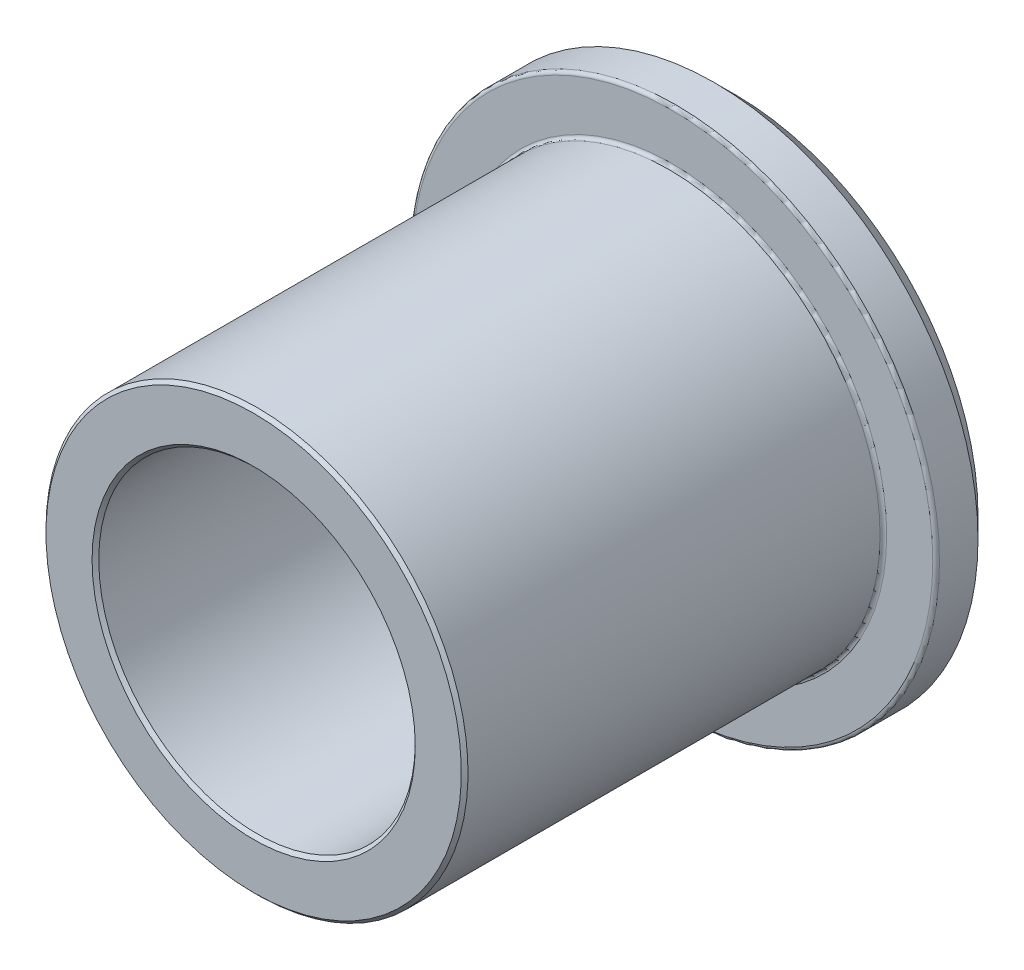
ISO-10303-21;
HEADER;
FILE_DESCRIPTION(('STEP AP214'),'2;1');
FILE_NAME('part.step','',(''),(''),'','','');
FILE_SCHEMA(('AUTOMOTIVE_DESIGN { 1 0 10303 214 1 1 1 1 }'));
ENDSEC;
DATA;
#1=APPLICATION_CONTEXT('core data for automotive mechanical design processes');
#2=APPLICATION_PROTOCOL_DEFINITION('international standard','automotive_design',2000,#1);
#3=PRODUCT_CONTEXT('',#1,'mechanical');
#4=PRODUCT('Part','Part','',(#3));
#5=PRODUCT_RELATED_PRODUCT_CATEGORY('part','',(#4));
#6=PRODUCT_DEFINITION_FORMATION('','',#4);
#7=PRODUCT_DEFINITION_CONTEXT('part definition',#1,'design');
#8=PRODUCT_DEFINITION('design','',#6,#7);
#9=PRODUCT_DEFINITION_SHAPE('','',#8);
#10=(LENGTH_UNIT() NAMED_UNIT(*) SI_UNIT(.MILLI.,.METRE.));
#11=(NAMED_UNIT(*) PLANE_ANGLE_UNIT() SI_UNIT($,.RADIAN.));
#12=(NAMED_UNIT(*) SI_UNIT($,.STERADIAN.) SOLID_ANGLE_UNIT());
#13=UNCERTAINTY_MEASURE_WITH_UNIT(LENGTH_MEASURE(1.E-05),#10,'distance_accuracy_value','');
#14=(GEOMETRIC_REPRESENTATION_CONTEXT(3) GLOBAL_UNCERTAINTY_ASSIGNED_CONTEXT((#13)) GLOBAL_UNIT_ASSIGNED_CONTEXT((#10,
#11,#12)) REPRESENTATION_CONTEXT('',''));
#15=CARTESIAN_POINT('',(0.,0.,0.));
#16=DIRECTION('',(0.,0.,1.));
#17=DIRECTION('',(1.,0.,0.));
#18=AXIS2_PLACEMENT_3D('',#15,#16,#17);
#19=CARTESIAN_POINT('',(5.04999999999999,-2.91561885940761,4.7625));
#20=DIRECTION('',(0.499999999999999,-0.866025403784439,0.));
#21=DIRECTION('',(0.866025403784439,0.499999999999999,0.));
#22=AXIS2_PLACEMENT_3D('',#19,#20,#21);
#23=PLANE('',#22);
#24=DIRECTION('',(-0.86602540378444,-0.499999999999999,0.));
#25=VECTOR('',#24,1.);
#26=CARTESIAN_POINT('',(5.04999999999999,-2.91561885940761,-2.38125));
#27=LINE('',#26,#25);
#28=CARTESIAN_POINT('',(5.04999999999999,-2.91561885940761,-2.38125));
#29=VERTEX_POINT('',#28);
#30=CARTESIAN_POINT('',(0.,-5.83123771881521,-2.38125));
#31=VERTEX_POINT('',#30);
#32=EDGE_CURVE('E152',#29,#31,#27,.T.);
#33=ORIENTED_EDGE('',*,*,#32,.T.);
#34=DIRECTION('',(0.,0.,1.));
#35=VECTOR('',#34,1.);
#36=CARTESIAN_POINT('',(0.,-5.83123771881521,4.7625));
#37=LINE('',#36,#35);
#38=CARTESIAN_POINT('',(0.,-5.83123771881521,4.7625));
#39=VERTEX_POINT('',#38);
#40=EDGE_CURVE('E75',#31,#39,#37,.T.);
#41=ORIENTED_EDGE('',*,*,#40,.T.);
#42=DIRECTION('',(-0.86602540378444,-0.499999999999999,0.));
#43=VECTOR('',#42,1.);
#44=CARTESIAN_POINT('',(5.04999999999999,-2.91561885940761,4.7625));
#45=LINE('',#44,#43);
#46=CARTESIAN_POINT('',(5.04999999999999,-2.91561885940761,4.7625));
#47=VERTEX_POINT('',#46);
#48=EDGE_CURVE('E150',#47,#39,#45,.T.);
#49=ORIENTED_EDGE('',*,*,#48,.F.);
#50=DIRECTION('',(0.,0.,1.));
#51=VECTOR('',#50,1.);
#52=CARTESIAN_POINT('',(5.04999999999999,-2.91561885940761,4.7625));
#53=LINE('',#52,#51);
#54=EDGE_CURVE('E108',#47,#29,#53,.F.);
#55=ORIENTED_EDGE('',*,*,#54,.T.);
#56=EDGE_LOOP('',(#33,#41,#49,#55));
#57=FACE_BOUND('',#56,.T.);
#58=ADVANCED_FACE('F25',(#57),#23,.F.);
#59=CARTESIAN_POINT('',(0.,-5.83123771881521,4.7625));
#60=DIRECTION('',(-0.500000000000002,-0.866025403784437,0.));
#61=DIRECTION('',(0.866025403784437,-0.500000000000002,0.));
#62=AXIS2_PLACEMENT_3D('',#59,#60,#61);
#63=PLANE('',#62);
#64=DIRECTION('',(-0.866025403784437,0.500000000000002,0.));
#65=VECTOR('',#64,1.);
#66=CARTESIAN_POINT('',(0.,-5.83123771881521,-2.38125));
#67=LINE('',#66,#65);
#68=CARTESIAN_POINT('',(-5.05,-2.91561885940759,-2.38125));
#69=VERTEX_POINT('',#68);
#70=EDGE_CURVE('E78',#31,#69,#67,.T.);
#71=ORIENTED_EDGE('',*,*,#70,.T.);
#72=DIRECTION('',(0.,0.,1.));
#73=VECTOR('',#72,1.);
#74=CARTESIAN_POINT('',(-5.05,-2.91561885940759,4.7625));
#75=LINE('',#74,#73);
#76=CARTESIAN_POINT('',(-5.05,-2.91561885940759,4.7625));
#77=VERTEX_POINT('',#76);
#78=EDGE_CURVE('E81',#69,#77,#75,.T.);
#79=ORIENTED_EDGE('',*,*,#78,.T.);
#80=DIRECTION('',(-0.866025403784437,0.500000000000002,0.));
#81=VECTOR('',#80,1.);
#82=CARTESIAN_POINT('',(0.,-5.83123771881521,4.7625));
#83=LINE('',#82,#81);
#84=EDGE_CURVE('E148',#39,#77,#83,.T.);
#85=ORIENTED_EDGE('',*,*,#84,.F.);
#86=ORIENTED_EDGE('',*,*,#40,.F.);
#87=EDGE_LOOP('',(#71,#79,#85,#86));
#88=FACE_BOUND('',#87,.T.);
#89=ADVANCED_FACE('F80',(#88),#63,.F.);
#90=CARTESIAN_POINT('',(-5.05,-2.91561885940759,4.7625));
#91=DIRECTION('',(-1.,0.,0.));
#92=DIRECTION('',(0.,-1.,0.));
#93=AXIS2_PLACEMENT_3D('',#90,#91,#92);
#94=PLANE('',#93);
#95=DIRECTION('',(0.,1.,0.));
#96=VECTOR('',#95,1.);
#97=CARTESIAN_POINT('',(-5.05,0.,-2.38125));
#98=LINE('',#97,#96);
#99=CARTESIAN_POINT('',(-5.04999999999999,2.91561885940762,-2.38125));
#100=VERTEX_POINT('',#99);
#101=EDGE_CURVE('E86',#69,#100,#98,.T.);
#102=ORIENTED_EDGE('',*,*,#101,.T.);
#103=DIRECTION('',(0.,0.,1.));
#104=VECTOR('',#103,1.);
#105=CARTESIAN_POINT('',(-5.04999999999998,2.91561885940762,4.7625));
#106=LINE('',#105,#104);
#107=CARTESIAN_POINT('',(-5.04999999999999,2.91561885940762,4.7625));
#108=VERTEX_POINT('',#107);
#109=EDGE_CURVE('E94',#100,#108,#106,.T.);
#110=ORIENTED_EDGE('',*,*,#109,.T.);
#111=DIRECTION('',(0.,1.,0.));
#112=VECTOR('',#111,1.);
#113=CARTESIAN_POINT('',(-5.05,0.,4.7625));
#114=LINE('',#113,#112);
#115=EDGE_CURVE('E92',#77,#108,#114,.T.);
#116=ORIENTED_EDGE('',*,*,#115,.F.);
#117=ORIENTED_EDGE('',*,*,#78,.F.);
#118=EDGE_LOOP('',(#102,#110,#116,#117));
#119=FACE_BOUND('',#118,.T.);
#120=ADVANCED_FACE('F89',(#119),#94,.F.);
#121=CARTESIAN_POINT('',(-5.04999999999998,2.91561885940762,4.7625));
#122=DIRECTION('',(-0.499999999999998,0.86602540378444,0.));
#123=DIRECTION('',(-0.86602540378444,-0.499999999999998,0.));
#124=AXIS2_PLACEMENT_3D('',#121,#122,#123);
#125=PLANE('',#124);
#126=DIRECTION('',(0.866025403784439,0.499999999999999,0.));
#127=VECTOR('',#126,1.);
#128=CARTESIAN_POINT('',(-5.04999999999998,2.91561885940762,-2.38125));
#129=LINE('',#128,#127);
#130=CARTESIAN_POINT('',(0.,5.83123771881521,-2.38125));
#131=VERTEX_POINT('',#130);
#132=EDGE_CURVE('E101',#100,#131,#129,.T.);
#133=ORIENTED_EDGE('',*,*,#132,.T.);
#134=DIRECTION('',(0.,0.,1.));
#135=VECTOR('',#134,1.);
#136=CARTESIAN_POINT('',(0.,5.83123771881521,4.7625));
#137=LINE('',#136,#135);
#138=CARTESIAN_POINT('',(0.,5.83123771881521,4.7625));
#139=VERTEX_POINT('',#138);
#140=EDGE_CURVE('E110',#131,#139,#137,.T.);
#141=ORIENTED_EDGE('',*,*,#140,.T.);
#142=DIRECTION('',(0.866025403784439,0.499999999999999,0.));
#143=VECTOR('',#142,1.);
#144=CARTESIAN_POINT('',(-5.04999999999998,2.91561885940762,4.7625));
#145=LINE('',#144,#143);
#146=EDGE_CURVE('E140',#108,#139,#145,.T.);
#147=ORIENTED_EDGE('',*,*,#146,.F.);
#148=ORIENTED_EDGE('',*,*,#109,.F.);
#149=EDGE_LOOP('',(#133,#141,#147,#148));
#150=FACE_BOUND('',#149,.T.);
#151=ADVANCED_FACE('F165',(#150),#125,.F.);
#152=CARTESIAN_POINT('',(0.,5.83123771881521,4.7625));
#153=DIRECTION('',(0.5,0.866025403784439,0.));
#154=DIRECTION('',(-0.866025403784439,0.5,0.));
#155=AXIS2_PLACEMENT_3D('',#152,#153,#154);
#156=PLANE('',#155);
#157=DIRECTION('',(0.866025403784439,-0.5,0.));
#158=VECTOR('',#157,1.);
#159=CARTESIAN_POINT('',(0.,5.83123771881521,-2.38125));
#160=LINE('',#159,#158);
#161=CARTESIAN_POINT('',(5.05,2.9156188594076,-2.38125));
#162=VERTEX_POINT('',#161);
#163=EDGE_CURVE('E103',#131,#162,#160,.T.);
#164=ORIENTED_EDGE('',*,*,#163,.T.);
#165=DIRECTION('',(0.,0.,1.));
#166=VECTOR('',#165,1.);
#167=CARTESIAN_POINT('',(5.05,2.9156188594076,4.7625));
#168=LINE('',#167,#166);
#169=CARTESIAN_POINT('',(5.05,2.9156188594076,4.7625));
#170=VERTEX_POINT('',#169);
#171=EDGE_CURVE('E43',#162,#170,#168,.T.);
#172=ORIENTED_EDGE('',*,*,#171,.T.);
#173=DIRECTION('',(0.866025403784439,-0.5,0.));
#174=VECTOR('',#173,1.);
#175=CARTESIAN_POINT('',(0.,5.83123771881521,4.7625));
#176=LINE('',#175,#174);
#177=EDGE_CURVE('E135',#139,#170,#176,.T.);
#178=ORIENTED_EDGE('',*,*,#177,.F.);
#179=ORIENTED_EDGE('',*,*,#140,.F.);
#180=EDGE_LOOP('',(#164,#172,#178,#179));
#181=FACE_BOUND('',#180,.T.);
#182=ADVANCED_FACE('F157',(#181),#156,.F.);
#183=CARTESIAN_POINT('',(5.05,2.9156188594076,4.7625));
#184=DIRECTION('',(1.,0.,0.));
#185=DIRECTION('',(0.,1.,0.));
#186=AXIS2_PLACEMENT_3D('',#183,#184,#185);
#187=PLANE('',#186);
#188=DIRECTION('',(0.,1.,0.));
#189=VECTOR('',#188,1.);
#190=CARTESIAN_POINT('',(5.05,0.,-2.38125));
#191=LINE('',#190,#189);
#192=EDGE_CURVE('E154',#162,#29,#191,.F.);
#193=ORIENTED_EDGE('',*,*,#192,.T.);
#194=ORIENTED_EDGE('',*,*,#54,.F.);
#195=DIRECTION('',(0.,1.,0.));
#196=VECTOR('',#195,1.);
#197=CARTESIAN_POINT('',(5.05,0.,4.7625));
#198=LINE('',#197,#196);
#199=EDGE_CURVE('E131',#170,#47,#198,.F.);
#200=ORIENTED_EDGE('',*,*,#199,.F.);
#201=ORIENTED_EDGE('',*,*,#171,.F.);
#202=EDGE_LOOP('',(#193,#194,#200,#201));
#203=FACE_BOUND('',#202,.T.);
#204=ADVANCED_FACE('F159',(#203),#187,.F.);
#205=CARTESIAN_POINT('',(0.,0.,-2.38125));
#206=DIRECTION('',(0.,0.,1.));
#207=DIRECTION('',(1.,0.,0.));
#208=AXIS2_PLACEMENT_3D('',#205,#206,#207);
#209=PLANE('',#208);
#210=ORIENTED_EDGE('',*,*,#192,.F.);
#211=ORIENTED_EDGE('',*,*,#163,.F.);
#212=ORIENTED_EDGE('',*,*,#132,.F.);
#213=ORIENTED_EDGE('',*,*,#101,.F.);
#214=ORIENTED_EDGE('',*,*,#70,.F.);
#215=ORIENTED_EDGE('',*,*,#32,.F.);
#216=EDGE_LOOP('',(#210,#211,#212,#213,#214,#215));
#217=FACE_BOUND('',#216,.T.);
#218=CARTESIAN_POINT('',(0.,0.,-2.38125));
#219=DIRECTION('',(0.,0.,1.));
#220=DIRECTION('',(1.,0.,0.));
#221=AXIS2_PLACEMENT_3D('',#218,#219,#220);
#222=CIRCLE('',#221,9.20625);
#223=CARTESIAN_POINT('',(9.20625,0.,-2.38125));
#224=VERTEX_POINT('',#223);
#225=EDGE_CURVE('E28',#224,#224,#222,.T.);
#226=ORIENTED_EDGE('',*,*,#225,.F.);
#227=EDGE_LOOP('',(#226));
#228=FACE_BOUND('',#227,.T.);
#229=ADVANCED_FACE('F98',(#217,#228),#209,.F.);
#230=CARTESIAN_POINT('',(0.,0.,4.7625));
#231=DIRECTION('',(0.,0.,1.));
#232=DIRECTION('',(1.,0.,0.));
#233=AXIS2_PLACEMENT_3D('',#230,#231,#232);
#234=PLANE('',#233);
#235=ORIENTED_EDGE('',*,*,#177,.T.);
#236=ORIENTED_EDGE('',*,*,#199,.T.);
#237=ORIENTED_EDGE('',*,*,#48,.T.);
#238=ORIENTED_EDGE('',*,*,#84,.T.);
#239=ORIENTED_EDGE('',*,*,#115,.T.);
#240=ORIENTED_EDGE('',*,*,#146,.T.);
#241=EDGE_LOOP('',(#235,#236,#237,#238,#239,#240));
#242=FACE_BOUND('',#241,.T.);
#243=CARTESIAN_POINT('',(0.,0.,4.7625));
#244=DIRECTION('',(0.,0.,-1.));
#245=DIRECTION('',(-1.,0.,0.));
#246=AXIS2_PLACEMENT_3D('',#243,#244,#245);
#247=CIRCLE('',#246,6.);
#248=CARTESIAN_POINT('',(-6.,0.,4.7625));
#249=VERTEX_POINT('',#248);
#250=EDGE_CURVE('E122',#249,#249,#247,.F.);
#251=ORIENTED_EDGE('',*,*,#250,.T.);
#252=EDGE_LOOP('',(#251));
#253=FACE_BOUND('',#252,.T.);
#254=ADVANCED_FACE('F162',(#242,#253),#234,.T.);
#255=CARTESIAN_POINT('',(0.,0.,-1.5875));
#256=DIRECTION('',(0.,0.,1.));
#257=DIRECTION('',(1.,0.,0.));
#258=AXIS2_PLACEMENT_3D('',#255,#256,#257);
#259=CONICAL_SURFACE('',#258,10.,0.785398163397448);
#260=CARTESIAN_POINT('',(0.,0.,-1.5875));
#261=DIRECTION('',(0.,0.,1.));
#262=DIRECTION('',(1.,0.,0.));
#263=AXIS2_PLACEMENT_3D('',#260,#261,#262);
#264=CIRCLE('',#263,10.);
#265=CARTESIAN_POINT('',(10.,0.,-1.5875));
#266=VERTEX_POINT('',#265);
#267=EDGE_CURVE('E124',#266,#266,#264,.T.);
#268=ORIENTED_EDGE('',*,*,#267,.F.);
#269=EDGE_LOOP('',(#268));
#270=FACE_BOUND('',#269,.T.);
#271=ORIENTED_EDGE('',*,*,#225,.T.);
#272=EDGE_LOOP('',(#271));
#273=FACE_BOUND('',#272,.T.);
#274=ADVANCED_FACE('F275',(#270,#273),#259,.T.);
#275=CARTESIAN_POINT('',(0.,0.,15.875));
#276=DIRECTION('',(0.,0.,-1.));
#277=DIRECTION('',(-1.,0.,0.));
#278=AXIS2_PLACEMENT_3D('',#275,#276,#277);
#279=CYLINDRICAL_SURFACE('',#278,6.);
#280=ORIENTED_EDGE('',*,*,#250,.F.);
#281=EDGE_LOOP('',(#280));
#282=FACE_BOUND('',#281,.T.);
#283=CARTESIAN_POINT('',(0.,0.,15.7479999999737));
#284=DIRECTION('',(0.,0.,1.));
#285=DIRECTION('',(1.,0.,0.));
#286=AXIS2_PLACEMENT_3D('',#283,#284,#285);
#287=CIRCLE('',#286,5.99999999997181);
#288=CARTESIAN_POINT('',(5.99999999997181,0.,15.7479999999737));
#289=VERTEX_POINT('',#288);
#290=EDGE_CURVE('E128',#289,#289,#287,.T.);
#291=ORIENTED_EDGE('',*,*,#290,.T.);
#292=EDGE_LOOP('',(#291));
#293=FACE_BOUND('',#292,.T.);
#294=ADVANCED_FACE('F268',(#282,#293),#279,.F.);
#295=CARTESIAN_POINT('',(0.,0.,-2.38125));
#296=DIRECTION('',(0.,0.,1.));
#297=DIRECTION('',(1.,0.,0.));
#298=AXIS2_PLACEMENT_3D('',#295,#296,#297);
#299=CYLINDRICAL_SURFACE('',#298,10.);
#300=ORIENTED_EDGE('',*,*,#267,.T.);
#301=EDGE_LOOP('',(#300));
#302=FACE_BOUND('',#301,.T.);
#303=CARTESIAN_POINT('',(0.,0.,-0.127));
#304=DIRECTION('',(0.,0.,1.));
#305=DIRECTION('',(1.,0.,0.));
#306=AXIS2_PLACEMENT_3D('',#303,#304,#305);
#307=CIRCLE('',#306,10.);
#308=CARTESIAN_POINT('',(10.,0.,-0.127));
#309=VERTEX_POINT('',#308);
#310=EDGE_CURVE('E121',#309,#309,#307,.T.);
#311=ORIENTED_EDGE('',*,*,#310,.F.);
#312=EDGE_LOOP('',(#311));
#313=FACE_BOUND('',#312,.T.);
#314=ADVANCED_FACE('F266',(#302,#313),#299,.T.);
#315=CARTESIAN_POINT('',(0.,0.,15.8749999999941));
#316=DIRECTION('',(0.,0.,1.));
#317=DIRECTION('',(1.,0.,0.));
#318=AXIS2_PLACEMENT_3D('',#315,#316,#317);
#319=CONICAL_SURFACE('',#318,6.12699999999222,0.785398163397448);
#320=ORIENTED_EDGE('',*,*,#290,.F.);
#321=EDGE_LOOP('',(#320));
#322=FACE_BOUND('',#321,.T.);
#323=CARTESIAN_POINT('',(0.,0.,15.8749999999941));
#324=DIRECTION('',(0.,0.,1.));
#325=DIRECTION('',(1.,0.,0.));
#326=AXIS2_PLACEMENT_3D('',#323,#324,#325);
#327=CIRCLE('',#326,6.12699999999222);
#328=CARTESIAN_POINT('',(6.12699999999222,0.,15.8749999999941));
#329=VERTEX_POINT('',#328);
#330=EDGE_CURVE('E119',#329,#329,#327,.F.);
#331=ORIENTED_EDGE('',*,*,#330,.F.);
#332=EDGE_LOOP('',(#331));
#333=FACE_BOUND('',#332,.T.);
#334=ADVANCED_FACE('F243',(#322,#333),#319,.F.);
#335=CARTESIAN_POINT('',(0.,0.,-0.127));
#336=DIRECTION('',(0.,0.,1.));
#337=DIRECTION('',(1.,0.,0.));
#338=AXIS2_PLACEMENT_3D('',#335,#336,#337);
#339=TOROIDAL_SURFACE('',#338,9.873,0.127);
#340=CARTESIAN_POINT('',(0.,0.,0.));
#341=DIRECTION('',(0.,0.,-1.));
#342=DIRECTION('',(1.,0.,0.));
#343=AXIS2_PLACEMENT_3D('',#340,#341,#342);
#344=CIRCLE('',#343,9.873);
#345=CARTESIAN_POINT('',(9.873,0.,0.));
#346=VERTEX_POINT('',#345);
#347=EDGE_CURVE('E118',#346,#346,#344,.F.);
#348=ORIENTED_EDGE('',*,*,#347,.F.);
#349=EDGE_LOOP('',(#348));
#350=FACE_BOUND('',#349,.T.);
#351=ORIENTED_EDGE('',*,*,#310,.T.);
#352=EDGE_LOOP('',(#351));
#353=FACE_BOUND('',#352,.T.);
#354=ADVANCED_FACE('F239',(#350,#353),#339,.T.);
#355=CARTESIAN_POINT('',(0.,0.,15.875));
#356=DIRECTION('',(0.,0.,1.));
#357=DIRECTION('',(1.,0.,0.));
#358=AXIS2_PLACEMENT_3D('',#355,#356,#357);
#359=PLANE('',#358);
#360=ORIENTED_EDGE('',*,*,#330,.T.);
#361=EDGE_LOOP('',(#360));
#362=FACE_BOUND('',#361,.T.);
#363=CARTESIAN_POINT('',(0.,0.,15.875));
#364=DIRECTION('',(0.,0.,-1.));
#365=DIRECTION('',(0.,1.,0.));
#366=AXIS2_PLACEMENT_3D('',#363,#364,#365);
#367=CIRCLE('',#366,7.873);
#368=CARTESIAN_POINT('',(0.,7.873,15.875));
#369=VERTEX_POINT('',#368);
#370=EDGE_CURVE('E114',#369,#369,#367,.T.);
#371=ORIENTED_EDGE('',*,*,#370,.F.);
#372=EDGE_LOOP('',(#371));
#373=FACE_BOUND('',#372,.T.);
#374=ADVANCED_FACE('F215',(#362,#373),#359,.T.);
#375=CARTESIAN_POINT('',(0.,0.,0.));
#376=DIRECTION('',(0.,0.,1.));
#377=DIRECTION('',(1.,0.,0.));
#378=AXIS2_PLACEMENT_3D('',#375,#376,#377);
#379=PLANE('',#378);
#380=ORIENTED_EDGE('',*,*,#347,.T.);
#381=EDGE_LOOP('',(#380));
#382=FACE_BOUND('',#381,.T.);
#383=CARTESIAN_POINT('',(0.,0.,0.));
#384=DIRECTION('',(0.,0.,1.));
#385=DIRECTION('',(1.,0.,0.));
#386=AXIS2_PLACEMENT_3D('',#383,#384,#385);
#387=CIRCLE('',#386,8.127);
#388=CARTESIAN_POINT('',(8.127,0.,0.));
#389=VERTEX_POINT('',#388);
#390=EDGE_CURVE('E117',#389,#389,#387,.F.);
#391=ORIENTED_EDGE('',*,*,#390,.T.);
#392=EDGE_LOOP('',(#391));
#393=FACE_BOUND('',#392,.T.);
#394=ADVANCED_FACE('F206',(#382,#393),#379,.T.);
#395=CARTESIAN_POINT('',(0.,0.,15.748));
#396=DIRECTION('',(0.,0.,-1.));
#397=DIRECTION('',(0.,1.,0.));
#398=AXIS2_PLACEMENT_3D('',#395,#396,#397);
#399=CONICAL_SURFACE('',#398,8.,0.785398163397455);
#400=ORIENTED_EDGE('',*,*,#370,.T.);
#401=EDGE_LOOP('',(#400));
#402=FACE_BOUND('',#401,.T.);
#403=CARTESIAN_POINT('',(0.,0.,15.748));
#404=DIRECTION('',(0.,0.,-1.));
#405=DIRECTION('',(-1.,0.,0.));
#406=AXIS2_PLACEMENT_3D('',#403,#404,#405);
#407=CIRCLE('',#406,8.);
#408=CARTESIAN_POINT('',(-8.,0.,15.748));
#409=VERTEX_POINT('',#408);
#410=EDGE_CURVE('E34',#409,#409,#407,.T.);
#411=ORIENTED_EDGE('',*,*,#410,.F.);
#412=EDGE_LOOP('',(#411));
#413=FACE_BOUND('',#412,.T.);
#414=ADVANCED_FACE('F183',(#402,#413),#399,.T.);
#415=CARTESIAN_POINT('',(0.,0.,0.126999999999999));
#416=DIRECTION('',(0.,0.,1.));
#417=DIRECTION('',(1.,0.,0.));
#418=AXIS2_PLACEMENT_3D('',#415,#416,#417);
#419=TOROIDAL_SURFACE('',#418,8.127,0.127);
#420=CARTESIAN_POINT('',(0.,0.,0.126999999999999));
#421=DIRECTION('',(0.,0.,-1.));
#422=DIRECTION('',(-1.,0.,0.));
#423=AXIS2_PLACEMENT_3D('',#420,#421,#422);
#424=CIRCLE('',#423,8.);
#425=CARTESIAN_POINT('',(-8.,0.,0.126999999999999));
#426=VERTEX_POINT('',#425);
#427=EDGE_CURVE('E13',#426,#426,#424,.F.);
#428=ORIENTED_EDGE('',*,*,#427,.F.);
#429=EDGE_LOOP('',(#428));
#430=FACE_BOUND('',#429,.T.);
#431=ORIENTED_EDGE('',*,*,#390,.F.);
#432=EDGE_LOOP('',(#431));
#433=FACE_BOUND('',#432,.T.);
#434=ADVANCED_FACE('F177',(#430,#433),#419,.F.);
#435=CARTESIAN_POINT('',(0.,0.,15.875));
#436=DIRECTION('',(0.,0.,-1.));
#437=DIRECTION('',(-1.,0.,0.));
#438=AXIS2_PLACEMENT_3D('',#435,#436,#437);
#439=CYLINDRICAL_SURFACE('',#438,8.);
#440=ORIENTED_EDGE('',*,*,#427,.T.);
#441=EDGE_LOOP('',(#440));
#442=FACE_BOUND('',#441,.T.);
#443=ORIENTED_EDGE('',*,*,#410,.T.);
#444=EDGE_LOOP('',(#443));
#445=FACE_BOUND('',#444,.T.);
#446=ADVANCED_FACE('F175',(#442,#445),#439,.T.);
#447=CLOSED_SHELL('',(#58,#89,#120,#151,#182,#204,#229,#254,#274,#294,#314,#334,#354,#374,#394,
#414,#434,#446));
#448=MANIFOLD_SOLID_BREP('B1',#447);
#449=ADVANCED_BREP_SHAPE_REPRESENTATION('',(#18,#448),#14);
#450=SHAPE_DEFINITION_REPRESENTATION(#9,#449);
ENDSEC;
END-ISO-10303-21;
